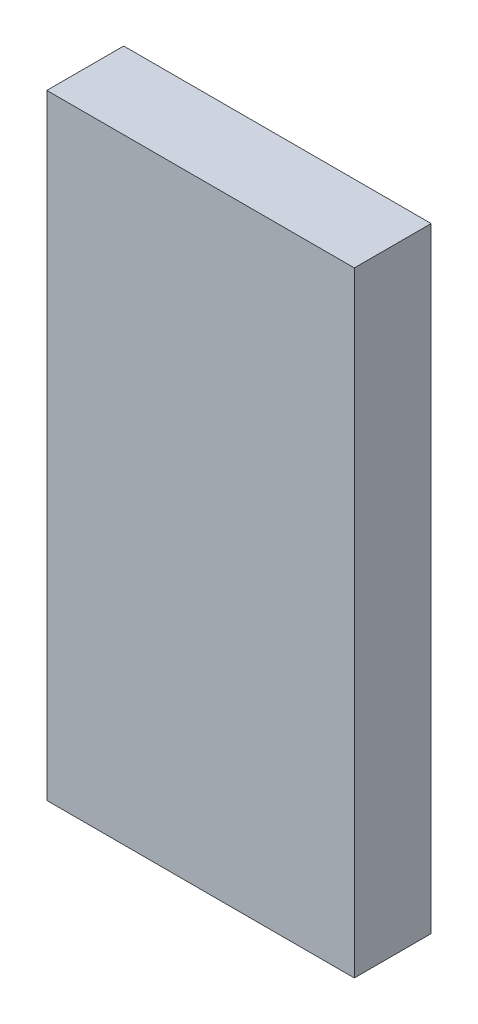
ISO-10303-21;
HEADER;
FILE_DESCRIPTION(('STEP AP214'),'2;1');
FILE_NAME('part.step','',(''),(''),'','','');
FILE_SCHEMA(('AUTOMOTIVE_DESIGN { 1 0 10303 214 1 1 1 1 }'));
ENDSEC;
DATA;
#1=APPLICATION_CONTEXT('core data for automotive mechanical design processes');
#2=APPLICATION_PROTOCOL_DEFINITION('international standard','automotive_design',2000,#1);
#3=PRODUCT_CONTEXT('',#1,'mechanical');
#4=PRODUCT('Part','Part','',(#3));
#5=PRODUCT_RELATED_PRODUCT_CATEGORY('part','',(#4));
#6=PRODUCT_DEFINITION_FORMATION('','',#4);
#7=PRODUCT_DEFINITION_CONTEXT('part definition',#1,'design');
#8=PRODUCT_DEFINITION('design','',#6,#7);
#9=PRODUCT_DEFINITION_SHAPE('','',#8);
#10=(LENGTH_UNIT() NAMED_UNIT(*) SI_UNIT(.MILLI.,.METRE.));
#11=(NAMED_UNIT(*) PLANE_ANGLE_UNIT() SI_UNIT($,.RADIAN.));
#12=(NAMED_UNIT(*) SI_UNIT($,.STERADIAN.) SOLID_ANGLE_UNIT());
#13=UNCERTAINTY_MEASURE_WITH_UNIT(LENGTH_MEASURE(1.E-05),#10,'distance_accuracy_value','');
#14=(GEOMETRIC_REPRESENTATION_CONTEXT(3) GLOBAL_UNCERTAINTY_ASSIGNED_CONTEXT((#13)) GLOBAL_UNIT_ASSIGNED_CONTEXT((#10,
#11,#12)) REPRESENTATION_CONTEXT('',''));
#15=CARTESIAN_POINT('',(0.,0.,0.));
#16=DIRECTION('',(0.,0.,1.));
#17=DIRECTION('',(1.,0.,0.));
#18=AXIS2_PLACEMENT_3D('',#15,#16,#17);
#19=CARTESIAN_POINT('',(3.175,-6.35,1.5875));
#20=DIRECTION('',(-1.,0.,0.));
#21=DIRECTION('',(0.,0.,1.));
#22=AXIS2_PLACEMENT_3D('',#19,#20,#21);
#23=PLANE('',#22);
#24=DIRECTION('',(0.,1.,0.));
#25=VECTOR('',#24,1.);
#26=CARTESIAN_POINT('',(3.175,-6.35,0.));
#27=LINE('',#26,#25);
#28=CARTESIAN_POINT('',(3.175,-6.35,0.));
#29=VERTEX_POINT('',#28);
#30=CARTESIAN_POINT('',(3.175,6.35,0.));
#31=VERTEX_POINT('',#30);
#32=EDGE_CURVE('E99',#29,#31,#27,.T.);
#33=ORIENTED_EDGE('',*,*,#32,.T.);
#34=DIRECTION('',(0.,0.,-1.));
#35=VECTOR('',#34,1.);
#36=CARTESIAN_POINT('',(3.175,6.35,1.5875));
#37=LINE('',#36,#35);
#38=CARTESIAN_POINT('',(3.175,6.35,1.5875));
#39=VERTEX_POINT('',#38);
#40=EDGE_CURVE('E11',#39,#31,#37,.T.);
#41=ORIENTED_EDGE('',*,*,#40,.F.);
#42=DIRECTION('',(0.,1.,0.));
#43=VECTOR('',#42,1.);
#44=CARTESIAN_POINT('',(3.175,-6.35,1.5875));
#45=LINE('',#44,#43);
#46=CARTESIAN_POINT('',(3.175,-6.35,1.5875));
#47=VERTEX_POINT('',#46);
#48=EDGE_CURVE('E87',#47,#39,#45,.T.);
#49=ORIENTED_EDGE('',*,*,#48,.F.);
#50=DIRECTION('',(0.,0.,-1.));
#51=VECTOR('',#50,1.);
#52=CARTESIAN_POINT('',(3.175,-6.35,1.5875));
#53=LINE('',#52,#51);
#54=EDGE_CURVE('E95',#47,#29,#53,.T.);
#55=ORIENTED_EDGE('',*,*,#54,.T.);
#56=EDGE_LOOP('',(#33,#41,#49,#55));
#57=FACE_BOUND('',#56,.T.);
#58=ADVANCED_FACE('F36',(#57),#23,.F.);
#59=CARTESIAN_POINT('',(-3.175,6.35,1.5875));
#60=DIRECTION('',(0.,-1.,0.));
#61=DIRECTION('',(0.,0.,-1.));
#62=AXIS2_PLACEMENT_3D('',#59,#60,#61);
#63=PLANE('',#62);
#64=DIRECTION('',(-1.,0.,0.));
#65=VECTOR('',#64,1.);
#66=CARTESIAN_POINT('',(-3.175,6.35,0.));
#67=LINE('',#66,#65);
#68=CARTESIAN_POINT('',(-3.175,6.35,0.));
#69=VERTEX_POINT('',#68);
#70=EDGE_CURVE('E91',#31,#69,#67,.T.);
#71=ORIENTED_EDGE('',*,*,#70,.T.);
#72=DIRECTION('',(0.,0.,-1.));
#73=VECTOR('',#72,1.);
#74=CARTESIAN_POINT('',(-3.175,6.35,1.5875));
#75=LINE('',#74,#73);
#76=CARTESIAN_POINT('',(-3.175,6.35,1.5875));
#77=VERTEX_POINT('',#76);
#78=EDGE_CURVE('E44',#77,#69,#75,.T.);
#79=ORIENTED_EDGE('',*,*,#78,.F.);
#80=DIRECTION('',(-1.,0.,0.));
#81=VECTOR('',#80,1.);
#82=CARTESIAN_POINT('',(-3.175,6.35,1.5875));
#83=LINE('',#82,#81);
#84=EDGE_CURVE('E82',#39,#77,#83,.T.);
#85=ORIENTED_EDGE('',*,*,#84,.F.);
#86=ORIENTED_EDGE('',*,*,#40,.T.);
#87=EDGE_LOOP('',(#71,#79,#85,#86));
#88=FACE_BOUND('',#87,.T.);
#89=ADVANCED_FACE('F90',(#88),#63,.F.);
#90=CARTESIAN_POINT('',(-3.175,-6.35,1.5875));
#91=DIRECTION('',(1.,0.,0.));
#92=DIRECTION('',(0.,0.,-1.));
#93=AXIS2_PLACEMENT_3D('',#90,#91,#92);
#94=PLANE('',#93);
#95=DIRECTION('',(0.,-1.,0.));
#96=VECTOR('',#95,1.);
#97=CARTESIAN_POINT('',(-3.175,-6.35,0.));
#98=LINE('',#97,#96);
#99=CARTESIAN_POINT('',(-3.175,-6.35,0.));
#100=VERTEX_POINT('',#99);
#101=EDGE_CURVE('E69',#69,#100,#98,.T.);
#102=ORIENTED_EDGE('',*,*,#101,.T.);
#103=DIRECTION('',(0.,0.,-1.));
#104=VECTOR('',#103,1.);
#105=CARTESIAN_POINT('',(-3.175,-6.35,1.5875));
#106=LINE('',#105,#104);
#107=CARTESIAN_POINT('',(-3.175,-6.35,1.5875));
#108=VERTEX_POINT('',#107);
#109=EDGE_CURVE('E92',#108,#100,#106,.T.);
#110=ORIENTED_EDGE('',*,*,#109,.F.);
#111=DIRECTION('',(0.,-1.,0.));
#112=VECTOR('',#111,1.);
#113=CARTESIAN_POINT('',(-3.175,-6.35,1.5875));
#114=LINE('',#113,#112);
#115=EDGE_CURVE('E85',#77,#108,#114,.T.);
#116=ORIENTED_EDGE('',*,*,#115,.F.);
#117=ORIENTED_EDGE('',*,*,#78,.T.);
#118=EDGE_LOOP('',(#102,#110,#116,#117));
#119=FACE_BOUND('',#118,.T.);
#120=ADVANCED_FACE('F93',(#119),#94,.F.);
#121=CARTESIAN_POINT('',(-3.175,-6.35,1.5875));
#122=DIRECTION('',(0.,1.,0.));
#123=DIRECTION('',(0.,0.,1.));
#124=AXIS2_PLACEMENT_3D('',#121,#122,#123);
#125=PLANE('',#124);
#126=DIRECTION('',(1.,0.,0.));
#127=VECTOR('',#126,1.);
#128=CARTESIAN_POINT('',(-3.175,-6.35,0.));
#129=LINE('',#128,#127);
#130=EDGE_CURVE('E75',#100,#29,#129,.T.);
#131=ORIENTED_EDGE('',*,*,#130,.T.);
#132=ORIENTED_EDGE('',*,*,#54,.F.);
#133=DIRECTION('',(1.,0.,0.));
#134=VECTOR('',#133,1.);
#135=CARTESIAN_POINT('',(-3.175,-6.35,1.5875));
#136=LINE('',#135,#134);
#137=EDGE_CURVE('E52',#108,#47,#136,.T.);
#138=ORIENTED_EDGE('',*,*,#137,.F.);
#139=ORIENTED_EDGE('',*,*,#109,.T.);
#140=EDGE_LOOP('',(#131,#132,#138,#139));
#141=FACE_BOUND('',#140,.T.);
#142=ADVANCED_FACE('F106',(#141),#125,.F.);
#143=CARTESIAN_POINT('',(0.,0.,1.5875));
#144=DIRECTION('',(0.,0.,-1.));
#145=DIRECTION('',(-1.,0.,0.));
#146=AXIS2_PLACEMENT_3D('',#143,#144,#145);
#147=PLANE('',#146);
#148=ORIENTED_EDGE('',*,*,#48,.T.);
#149=ORIENTED_EDGE('',*,*,#84,.T.);
#150=ORIENTED_EDGE('',*,*,#115,.T.);
#151=ORIENTED_EDGE('',*,*,#137,.T.);
#152=EDGE_LOOP('',(#148,#149,#150,#151));
#153=FACE_BOUND('',#152,.T.);
#154=ADVANCED_FACE('F83',(#153),#147,.F.);
#155=CARTESIAN_POINT('',(0.,0.,0.));
#156=DIRECTION('',(0.,0.,-1.));
#157=DIRECTION('',(-1.,0.,0.));
#158=AXIS2_PLACEMENT_3D('',#155,#156,#157);
#159=PLANE('',#158);
#160=ORIENTED_EDGE('',*,*,#32,.F.);
#161=ORIENTED_EDGE('',*,*,#130,.F.);
#162=ORIENTED_EDGE('',*,*,#101,.F.);
#163=ORIENTED_EDGE('',*,*,#70,.F.);
#164=EDGE_LOOP('',(#160,#161,#162,#163));
#165=FACE_BOUND('',#164,.T.);
#166=ADVANCED_FACE('F109',(#165),#159,.T.);
#167=CLOSED_SHELL('',(#58,#89,#120,#142,#154,#166));
#168=MANIFOLD_SOLID_BREP('B2',#167);
#169=ADVANCED_BREP_SHAPE_REPRESENTATION('',(#18,#168),#14);
#170=SHAPE_DEFINITION_REPRESENTATION(#9,#169);
ENDSEC;
END-ISO-10303-21;
